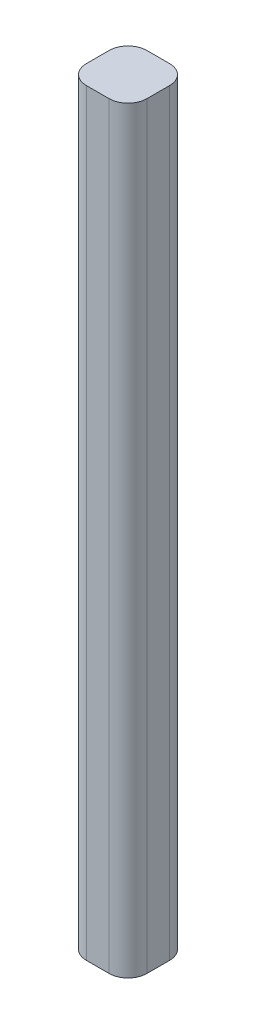
ISO-10303-21;
HEADER;
FILE_DESCRIPTION(('STEP AP214'),'2;1');
FILE_NAME('part.step','',(''),(''),'','','');
FILE_SCHEMA(('AUTOMOTIVE_DESIGN { 1 0 10303 214 1 1 1 1 }'));
ENDSEC;
DATA;
#1=APPLICATION_CONTEXT('core data for automotive mechanical design processes');
#2=APPLICATION_PROTOCOL_DEFINITION('international standard','automotive_design',2000,#1);
#3=PRODUCT_CONTEXT('',#1,'mechanical');
#4=PRODUCT('Part','Part','',(#3));
#5=PRODUCT_RELATED_PRODUCT_CATEGORY('part','',(#4));
#6=PRODUCT_DEFINITION_FORMATION('','',#4);
#7=PRODUCT_DEFINITION_CONTEXT('part definition',#1,'design');
#8=PRODUCT_DEFINITION('design','',#6,#7);
#9=PRODUCT_DEFINITION_SHAPE('','',#8);
#10=(LENGTH_UNIT() NAMED_UNIT(*) SI_UNIT(.MILLI.,.METRE.));
#11=(NAMED_UNIT(*) PLANE_ANGLE_UNIT() SI_UNIT($,.RADIAN.));
#12=(NAMED_UNIT(*) SI_UNIT($,.STERADIAN.) SOLID_ANGLE_UNIT());
#13=UNCERTAINTY_MEASURE_WITH_UNIT(LENGTH_MEASURE(1.E-05),#10,'distance_accuracy_value','');
#14=(GEOMETRIC_REPRESENTATION_CONTEXT(3) GLOBAL_UNCERTAINTY_ASSIGNED_CONTEXT((#13)) GLOBAL_UNIT_ASSIGNED_CONTEXT((#10,
#11,#12)) REPRESENTATION_CONTEXT('',''));
#15=CARTESIAN_POINT('',(0.,0.,0.));
#16=DIRECTION('',(0.,0.,1.));
#17=DIRECTION('',(1.,0.,0.));
#18=AXIS2_PLACEMENT_3D('',#15,#16,#17);
#19=CARTESIAN_POINT('',(-15.,500.,15.));
#20=DIRECTION('',(0.,-1.,0.));
#21=DIRECTION('',(0.,0.,-1.));
#22=AXIS2_PLACEMENT_3D('',#19,#20,#21);
#23=CYLINDRICAL_SURFACE('',#22,25.);
#24=CARTESIAN_POINT('',(-15.,-500.,15.));
#25=DIRECTION('',(0.,1.,0.));
#26=DIRECTION('',(0.,0.,-1.));
#27=AXIS2_PLACEMENT_3D('',#24,#25,#26);
#28=CIRCLE('',#27,25.);
#29=CARTESIAN_POINT('',(-40.,-500.,15.));
#30=VERTEX_POINT('',#29);
#31=CARTESIAN_POINT('',(-15.,-500.,40.));
#32=VERTEX_POINT('',#31);
#33=EDGE_CURVE('E128',#30,#32,#28,.T.);
#34=ORIENTED_EDGE('',*,*,#33,.T.);
#35=DIRECTION('',(0.,-1.,0.));
#36=VECTOR('',#35,1.);
#37=CARTESIAN_POINT('',(-15.,500.,40.));
#38=LINE('',#37,#36);
#39=CARTESIAN_POINT('',(-15.,500.,40.));
#40=VERTEX_POINT('',#39);
#41=EDGE_CURVE('E11',#40,#32,#38,.T.);
#42=ORIENTED_EDGE('',*,*,#41,.F.);
#43=CARTESIAN_POINT('',(-15.,500.,15.));
#44=DIRECTION('',(0.,1.,0.));
#45=DIRECTION('',(0.,0.,-1.));
#46=AXIS2_PLACEMENT_3D('',#43,#44,#45);
#47=CIRCLE('',#46,25.);
#48=CARTESIAN_POINT('',(-40.,500.,15.));
#49=VERTEX_POINT('',#48);
#50=EDGE_CURVE('E142',#49,#40,#47,.T.);
#51=ORIENTED_EDGE('',*,*,#50,.F.);
#52=DIRECTION('',(0.,-1.,0.));
#53=VECTOR('',#52,1.);
#54=CARTESIAN_POINT('',(-40.,500.,15.));
#55=LINE('',#54,#53);
#56=EDGE_CURVE('E124',#49,#30,#55,.T.);
#57=ORIENTED_EDGE('',*,*,#56,.T.);
#58=EDGE_LOOP('',(#34,#42,#51,#57));
#59=FACE_BOUND('',#58,.T.);
#60=ADVANCED_FACE('F32',(#59),#23,.T.);
#61=CARTESIAN_POINT('',(15.,500.,40.));
#62=DIRECTION('',(0.,0.,-1.));
#63=DIRECTION('',(-1.,0.,0.));
#64=AXIS2_PLACEMENT_3D('',#61,#62,#63);
#65=PLANE('',#64);
#66=DIRECTION('',(1.,0.,0.));
#67=VECTOR('',#66,1.);
#68=CARTESIAN_POINT('',(15.,-500.,40.));
#69=LINE('',#68,#67);
#70=CARTESIAN_POINT('',(15.,-500.,40.));
#71=VERTEX_POINT('',#70);
#72=EDGE_CURVE('E131',#32,#71,#69,.T.);
#73=ORIENTED_EDGE('',*,*,#72,.T.);
#74=DIRECTION('',(0.,-1.,0.));
#75=VECTOR('',#74,1.);
#76=CARTESIAN_POINT('',(15.,500.,40.));
#77=LINE('',#76,#75);
#78=CARTESIAN_POINT('',(15.,500.,40.));
#79=VERTEX_POINT('',#78);
#80=EDGE_CURVE('E40',#79,#71,#77,.T.);
#81=ORIENTED_EDGE('',*,*,#80,.F.);
#82=DIRECTION('',(1.,0.,0.));
#83=VECTOR('',#82,1.);
#84=CARTESIAN_POINT('',(15.,500.,40.));
#85=LINE('',#84,#83);
#86=EDGE_CURVE('E91',#40,#79,#85,.T.);
#87=ORIENTED_EDGE('',*,*,#86,.F.);
#88=ORIENTED_EDGE('',*,*,#41,.T.);
#89=EDGE_LOOP('',(#73,#81,#87,#88));
#90=FACE_BOUND('',#89,.T.);
#91=ADVANCED_FACE('F177',(#90),#65,.F.);
#92=CARTESIAN_POINT('',(15.,500.,15.));
#93=DIRECTION('',(0.,-1.,0.));
#94=DIRECTION('',(0.,0.,-1.));
#95=AXIS2_PLACEMENT_3D('',#92,#93,#94);
#96=CYLINDRICAL_SURFACE('',#95,25.);
#97=CARTESIAN_POINT('',(15.,-500.,15.));
#98=DIRECTION('',(0.,1.,0.));
#99=DIRECTION('',(0.,0.,1.));
#100=AXIS2_PLACEMENT_3D('',#97,#98,#99);
#101=CIRCLE('',#100,25.);
#102=CARTESIAN_POINT('',(40.,-500.,15.));
#103=VERTEX_POINT('',#102);
#104=EDGE_CURVE('E133',#71,#103,#101,.T.);
#105=ORIENTED_EDGE('',*,*,#104,.T.);
#106=DIRECTION('',(0.,-1.,0.));
#107=VECTOR('',#106,1.);
#108=CARTESIAN_POINT('',(40.,500.,15.));
#109=LINE('',#108,#107);
#110=CARTESIAN_POINT('',(40.,500.,15.));
#111=VERTEX_POINT('',#110);
#112=EDGE_CURVE('E149',#111,#103,#109,.T.);
#113=ORIENTED_EDGE('',*,*,#112,.F.);
#114=CARTESIAN_POINT('',(15.,500.,15.));
#115=DIRECTION('',(0.,1.,0.));
#116=DIRECTION('',(0.,0.,1.));
#117=AXIS2_PLACEMENT_3D('',#114,#115,#116);
#118=CIRCLE('',#117,25.);
#119=EDGE_CURVE('E157',#79,#111,#118,.T.);
#120=ORIENTED_EDGE('',*,*,#119,.F.);
#121=ORIENTED_EDGE('',*,*,#80,.T.);
#122=EDGE_LOOP('',(#105,#113,#120,#121));
#123=FACE_BOUND('',#122,.T.);
#124=ADVANCED_FACE('F155',(#123),#96,.T.);
#125=CARTESIAN_POINT('',(40.,500.,15.));
#126=DIRECTION('',(-1.,0.,0.));
#127=DIRECTION('',(0.,0.,1.));
#128=AXIS2_PLACEMENT_3D('',#125,#126,#127);
#129=PLANE('',#128);
#130=DIRECTION('',(0.,0.,-1.));
#131=VECTOR('',#130,1.);
#132=CARTESIAN_POINT('',(40.,-500.,15.));
#133=LINE('',#132,#131);
#134=CARTESIAN_POINT('',(40.,-500.,-15.));
#135=VERTEX_POINT('',#134);
#136=EDGE_CURVE('E135',#103,#135,#133,.T.);
#137=ORIENTED_EDGE('',*,*,#136,.T.);
#138=DIRECTION('',(0.,-1.,0.));
#139=VECTOR('',#138,1.);
#140=CARTESIAN_POINT('',(40.,500.,-15.));
#141=LINE('',#140,#139);
#142=CARTESIAN_POINT('',(40.,500.,-15.));
#143=VERTEX_POINT('',#142);
#144=EDGE_CURVE('E146',#143,#135,#141,.T.);
#145=ORIENTED_EDGE('',*,*,#144,.F.);
#146=DIRECTION('',(0.,0.,-1.));
#147=VECTOR('',#146,1.);
#148=CARTESIAN_POINT('',(40.,500.,15.));
#149=LINE('',#148,#147);
#150=EDGE_CURVE('E169',#111,#143,#149,.T.);
#151=ORIENTED_EDGE('',*,*,#150,.F.);
#152=ORIENTED_EDGE('',*,*,#112,.T.);
#153=EDGE_LOOP('',(#137,#145,#151,#152));
#154=FACE_BOUND('',#153,.T.);
#155=ADVANCED_FACE('F165',(#154),#129,.F.);
#156=CARTESIAN_POINT('',(15.,500.,-15.));
#157=DIRECTION('',(0.,-1.,0.));
#158=DIRECTION('',(0.,0.,-1.));
#159=AXIS2_PLACEMENT_3D('',#156,#157,#158);
#160=CYLINDRICAL_SURFACE('',#159,25.);
#161=CARTESIAN_POINT('',(15.,-500.,-15.));
#162=DIRECTION('',(0.,1.,0.));
#163=DIRECTION('',(0.,0.,1.));
#164=AXIS2_PLACEMENT_3D('',#161,#162,#163);
#165=CIRCLE('',#164,25.);
#166=CARTESIAN_POINT('',(15.,-500.,-40.));
#167=VERTEX_POINT('',#166);
#168=EDGE_CURVE('E137',#135,#167,#165,.T.);
#169=ORIENTED_EDGE('',*,*,#168,.T.);
#170=DIRECTION('',(0.,-1.,0.));
#171=VECTOR('',#170,1.);
#172=CARTESIAN_POINT('',(15.,500.,-40.));
#173=LINE('',#172,#171);
#174=CARTESIAN_POINT('',(15.,500.,-40.));
#175=VERTEX_POINT('',#174);
#176=EDGE_CURVE('E119',#175,#167,#173,.T.);
#177=ORIENTED_EDGE('',*,*,#176,.F.);
#178=CARTESIAN_POINT('',(15.,500.,-15.));
#179=DIRECTION('',(0.,1.,0.));
#180=DIRECTION('',(0.,0.,1.));
#181=AXIS2_PLACEMENT_3D('',#178,#179,#180);
#182=CIRCLE('',#181,25.);
#183=EDGE_CURVE('E110',#143,#175,#182,.T.);
#184=ORIENTED_EDGE('',*,*,#183,.F.);
#185=ORIENTED_EDGE('',*,*,#144,.T.);
#186=EDGE_LOOP('',(#169,#177,#184,#185));
#187=FACE_BOUND('',#186,.T.);
#188=ADVANCED_FACE('F168',(#187),#160,.T.);
#189=CARTESIAN_POINT('',(15.,500.,-40.));
#190=DIRECTION('',(0.,0.,1.));
#191=DIRECTION('',(1.,0.,0.));
#192=AXIS2_PLACEMENT_3D('',#189,#190,#191);
#193=PLANE('',#192);
#194=DIRECTION('',(-1.,0.,0.));
#195=VECTOR('',#194,1.);
#196=CARTESIAN_POINT('',(15.,-500.,-40.));
#197=LINE('',#196,#195);
#198=CARTESIAN_POINT('',(-15.,-500.,-40.));
#199=VERTEX_POINT('',#198);
#200=EDGE_CURVE('E118',#167,#199,#197,.T.);
#201=ORIENTED_EDGE('',*,*,#200,.T.);
#202=DIRECTION('',(0.,-1.,0.));
#203=VECTOR('',#202,1.);
#204=CARTESIAN_POINT('',(-15.,500.,-40.));
#205=LINE('',#204,#203);
#206=CARTESIAN_POINT('',(-15.,500.,-40.));
#207=VERTEX_POINT('',#206);
#208=EDGE_CURVE('E115',#207,#199,#205,.T.);
#209=ORIENTED_EDGE('',*,*,#208,.F.);
#210=DIRECTION('',(-1.,0.,0.));
#211=VECTOR('',#210,1.);
#212=CARTESIAN_POINT('',(15.,500.,-40.));
#213=LINE('',#212,#211);
#214=EDGE_CURVE('E104',#175,#207,#213,.T.);
#215=ORIENTED_EDGE('',*,*,#214,.F.);
#216=ORIENTED_EDGE('',*,*,#176,.T.);
#217=EDGE_LOOP('',(#201,#209,#215,#216));
#218=FACE_BOUND('',#217,.T.);
#219=ADVANCED_FACE('F116',(#218),#193,.F.);
#220=CARTESIAN_POINT('',(-15.,500.,-15.));
#221=DIRECTION('',(0.,-1.,0.));
#222=DIRECTION('',(0.,0.,-1.));
#223=AXIS2_PLACEMENT_3D('',#220,#221,#222);
#224=CYLINDRICAL_SURFACE('',#223,25.);
#225=CARTESIAN_POINT('',(-15.,-500.,-15.));
#226=DIRECTION('',(0.,1.,0.));
#227=DIRECTION('',(0.,0.,1.));
#228=AXIS2_PLACEMENT_3D('',#225,#226,#227);
#229=CIRCLE('',#228,25.);
#230=CARTESIAN_POINT('',(-40.,-500.,-15.));
#231=VERTEX_POINT('',#230);
#232=EDGE_CURVE('E77',#199,#231,#229,.T.);
#233=ORIENTED_EDGE('',*,*,#232,.T.);
#234=DIRECTION('',(0.,-1.,0.));
#235=VECTOR('',#234,1.);
#236=CARTESIAN_POINT('',(-40.,500.,-15.));
#237=LINE('',#236,#235);
#238=CARTESIAN_POINT('',(-40.,500.,-15.));
#239=VERTEX_POINT('',#238);
#240=EDGE_CURVE('E120',#239,#231,#237,.T.);
#241=ORIENTED_EDGE('',*,*,#240,.F.);
#242=CARTESIAN_POINT('',(-15.,500.,-15.));
#243=DIRECTION('',(0.,1.,0.));
#244=DIRECTION('',(0.,0.,1.));
#245=AXIS2_PLACEMENT_3D('',#242,#243,#244);
#246=CIRCLE('',#245,25.);
#247=EDGE_CURVE('E108',#207,#239,#246,.T.);
#248=ORIENTED_EDGE('',*,*,#247,.F.);
#249=ORIENTED_EDGE('',*,*,#208,.T.);
#250=EDGE_LOOP('',(#233,#241,#248,#249));
#251=FACE_BOUND('',#250,.T.);
#252=ADVANCED_FACE('F122',(#251),#224,.T.);
#253=CARTESIAN_POINT('',(-40.,500.,15.));
#254=DIRECTION('',(1.,0.,0.));
#255=DIRECTION('',(0.,0.,-1.));
#256=AXIS2_PLACEMENT_3D('',#253,#254,#255);
#257=PLANE('',#256);
#258=DIRECTION('',(0.,0.,1.));
#259=VECTOR('',#258,1.);
#260=CARTESIAN_POINT('',(-40.,-500.,15.));
#261=LINE('',#260,#259);
#262=EDGE_CURVE('E83',#231,#30,#261,.T.);
#263=ORIENTED_EDGE('',*,*,#262,.T.);
#264=ORIENTED_EDGE('',*,*,#56,.F.);
#265=DIRECTION('',(0.,0.,1.));
#266=VECTOR('',#265,1.);
#267=CARTESIAN_POINT('',(-40.,500.,15.));
#268=LINE('',#267,#266);
#269=EDGE_CURVE('E48',#239,#49,#268,.T.);
#270=ORIENTED_EDGE('',*,*,#269,.F.);
#271=ORIENTED_EDGE('',*,*,#240,.T.);
#272=EDGE_LOOP('',(#263,#264,#270,#271));
#273=FACE_BOUND('',#272,.T.);
#274=ADVANCED_FACE('F193',(#273),#257,.F.);
#275=CARTESIAN_POINT('',(-15.,500.,15.));
#276=DIRECTION('',(0.,-1.,0.));
#277=DIRECTION('',(0.,0.,-1.));
#278=AXIS2_PLACEMENT_3D('',#275,#276,#277);
#279=PLANE('',#278);
#280=ORIENTED_EDGE('',*,*,#50,.T.);
#281=ORIENTED_EDGE('',*,*,#86,.T.);
#282=ORIENTED_EDGE('',*,*,#119,.T.);
#283=ORIENTED_EDGE('',*,*,#150,.T.);
#284=ORIENTED_EDGE('',*,*,#183,.T.);
#285=ORIENTED_EDGE('',*,*,#214,.T.);
#286=ORIENTED_EDGE('',*,*,#247,.T.);
#287=ORIENTED_EDGE('',*,*,#269,.T.);
#288=EDGE_LOOP('',(#280,#281,#282,#283,#284,#285,#286,#287));
#289=FACE_BOUND('',#288,.T.);
#290=ADVANCED_FACE('F106',(#289),#279,.F.);
#291=CARTESIAN_POINT('',(-15.,-500.,15.));
#292=DIRECTION('',(0.,-1.,0.));
#293=DIRECTION('',(0.,0.,-1.));
#294=AXIS2_PLACEMENT_3D('',#291,#292,#293);
#295=PLANE('',#294);
#296=ORIENTED_EDGE('',*,*,#33,.F.);
#297=ORIENTED_EDGE('',*,*,#262,.F.);
#298=ORIENTED_EDGE('',*,*,#232,.F.);
#299=ORIENTED_EDGE('',*,*,#200,.F.);
#300=ORIENTED_EDGE('',*,*,#168,.F.);
#301=ORIENTED_EDGE('',*,*,#136,.F.);
#302=ORIENTED_EDGE('',*,*,#104,.F.);
#303=ORIENTED_EDGE('',*,*,#72,.F.);
#304=EDGE_LOOP('',(#296,#297,#298,#299,#300,#301,#302,#303));
#305=FACE_BOUND('',#304,.T.);
#306=ADVANCED_FACE('F161',(#305),#295,.T.);
#307=CLOSED_SHELL('',(#60,#91,#124,#155,#188,#219,#252,#274,#290,#306));
#308=MANIFOLD_SOLID_BREP('B2',#307);
#309=ADVANCED_BREP_SHAPE_REPRESENTATION('',(#18,#308),#14);
#310=SHAPE_DEFINITION_REPRESENTATION(#9,#309);
ENDSEC;
END-ISO-10303-21;
